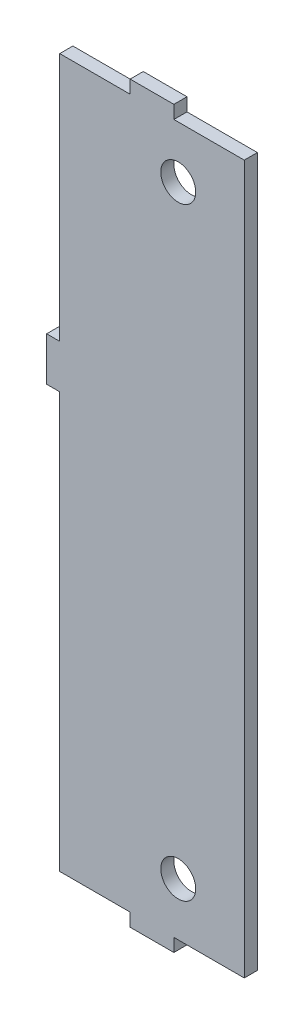
ISO-10303-21;
HEADER;
FILE_DESCRIPTION(('STEP AP214'),'2;1');
FILE_NAME('part.step','',(''),(''),'','','');
FILE_SCHEMA(('AUTOMOTIVE_DESIGN { 1 0 10303 214 1 1 1 1 }'));
ENDSEC;
DATA;
#1=APPLICATION_CONTEXT('core data for automotive mechanical design processes');
#2=APPLICATION_PROTOCOL_DEFINITION('international standard','automotive_design',2000,#1);
#3=PRODUCT_CONTEXT('',#1,'mechanical');
#4=PRODUCT('Part','Part','',(#3));
#5=PRODUCT_RELATED_PRODUCT_CATEGORY('part','',(#4));
#6=PRODUCT_DEFINITION_FORMATION('','',#4);
#7=PRODUCT_DEFINITION_CONTEXT('part definition',#1,'design');
#8=PRODUCT_DEFINITION('design','',#6,#7);
#9=PRODUCT_DEFINITION_SHAPE('','',#8);
#10=(LENGTH_UNIT() NAMED_UNIT(*) SI_UNIT(.MILLI.,.METRE.));
#11=(NAMED_UNIT(*) PLANE_ANGLE_UNIT() SI_UNIT($,.RADIAN.));
#12=(NAMED_UNIT(*) SI_UNIT($,.STERADIAN.) SOLID_ANGLE_UNIT());
#13=UNCERTAINTY_MEASURE_WITH_UNIT(LENGTH_MEASURE(1.E-05),#10,'distance_accuracy_value','');
#14=(GEOMETRIC_REPRESENTATION_CONTEXT(3) GLOBAL_UNCERTAINTY_ASSIGNED_CONTEXT((#13)) GLOBAL_UNIT_ASSIGNED_CONTEXT((#10,
#11,#12)) REPRESENTATION_CONTEXT('',''));
#15=CARTESIAN_POINT('',(0.,0.,0.));
#16=DIRECTION('',(0.,0.,1.));
#17=DIRECTION('',(1.,0.,0.));
#18=AXIS2_PLACEMENT_3D('',#15,#16,#17);
#19=CARTESIAN_POINT('',(-21.1,-60.,1.5));
#20=DIRECTION('',(0.,-1.,0.));
#21=DIRECTION('',(0.,0.,-1.));
#22=AXIS2_PLACEMENT_3D('',#19,#20,#21);
#23=PLANE('',#22);
#24=DIRECTION('',(-1.,0.,0.));
#25=VECTOR('',#24,1.);
#26=CARTESIAN_POINT('',(-21.1,-60.,-1.5));
#27=LINE('',#26,#25);
#28=CARTESIAN_POINT('',(-21.1,-60.,-1.5));
#29=VERTEX_POINT('',#28);
#30=CARTESIAN_POINT('',(-24.1,-60.,-1.5));
#31=VERTEX_POINT('',#30);
#32=EDGE_CURVE('E179',#29,#31,#27,.T.);
#33=ORIENTED_EDGE('',*,*,#32,.T.);
#34=DIRECTION('',(0.,0.,-1.));
#35=VECTOR('',#34,1.);
#36=CARTESIAN_POINT('',(-24.1,-60.,1.5));
#37=LINE('',#36,#35);
#38=CARTESIAN_POINT('',(-24.1,-60.,1.5));
#39=VERTEX_POINT('',#38);
#40=EDGE_CURVE('E11',#39,#31,#37,.T.);
#41=ORIENTED_EDGE('',*,*,#40,.F.);
#42=DIRECTION('',(-1.,0.,0.));
#43=VECTOR('',#42,1.);
#44=CARTESIAN_POINT('',(-21.1,-60.,1.5));
#45=LINE('',#44,#43);
#46=CARTESIAN_POINT('',(-21.1,-60.,1.5));
#47=VERTEX_POINT('',#46);
#48=EDGE_CURVE('E210',#47,#39,#45,.T.);
#49=ORIENTED_EDGE('',*,*,#48,.F.);
#50=DIRECTION('',(0.,0.,-1.));
#51=VECTOR('',#50,1.);
#52=CARTESIAN_POINT('',(-21.1,-60.,1.5));
#53=LINE('',#52,#51);
#54=EDGE_CURVE('E175',#47,#29,#53,.T.);
#55=ORIENTED_EDGE('',*,*,#54,.T.);
#56=EDGE_LOOP('',(#33,#41,#49,#55));
#57=FACE_BOUND('',#56,.T.);
#58=ADVANCED_FACE('F35',(#57),#23,.F.);
#59=CARTESIAN_POINT('',(-24.1,-60.,1.5));
#60=DIRECTION('',(1.,0.,0.));
#61=DIRECTION('',(0.,0.,-1.));
#62=AXIS2_PLACEMENT_3D('',#59,#60,#61);
#63=PLANE('',#62);
#64=DIRECTION('',(0.,-1.,0.));
#65=VECTOR('',#64,1.);
#66=CARTESIAN_POINT('',(-24.1,-60.,-1.5));
#67=LINE('',#66,#65);
#68=CARTESIAN_POINT('',(-24.1,-70.,-1.5));
#69=VERTEX_POINT('',#68);
#70=EDGE_CURVE('E182',#31,#69,#67,.T.);
#71=ORIENTED_EDGE('',*,*,#70,.T.);
#72=DIRECTION('',(0.,0.,-1.));
#73=VECTOR('',#72,1.);
#74=CARTESIAN_POINT('',(-24.1,-70.,1.5));
#75=LINE('',#74,#73);
#76=CARTESIAN_POINT('',(-24.1,-70.,1.5));
#77=VERTEX_POINT('',#76);
#78=EDGE_CURVE('E43',#77,#69,#75,.T.);
#79=ORIENTED_EDGE('',*,*,#78,.F.);
#80=DIRECTION('',(0.,-1.,0.));
#81=VECTOR('',#80,1.);
#82=CARTESIAN_POINT('',(-24.1,-60.,1.5));
#83=LINE('',#82,#81);
#84=EDGE_CURVE('E118',#39,#77,#83,.T.);
#85=ORIENTED_EDGE('',*,*,#84,.F.);
#86=ORIENTED_EDGE('',*,*,#40,.T.);
#87=EDGE_LOOP('',(#71,#79,#85,#86));
#88=FACE_BOUND('',#87,.T.);
#89=ADVANCED_FACE('F310',(#88),#63,.F.);
#90=CARTESIAN_POINT('',(-24.1,-70.,1.5));
#91=DIRECTION('',(0.,1.,0.));
#92=DIRECTION('',(0.,0.,1.));
#93=AXIS2_PLACEMENT_3D('',#90,#91,#92);
#94=PLANE('',#93);
#95=DIRECTION('',(1.,0.,0.));
#96=VECTOR('',#95,1.);
#97=CARTESIAN_POINT('',(-24.1,-70.,-1.5));
#98=LINE('',#97,#96);
#99=CARTESIAN_POINT('',(-21.1,-70.,-1.5));
#100=VERTEX_POINT('',#99);
#101=EDGE_CURVE('E185',#69,#100,#98,.T.);
#102=ORIENTED_EDGE('',*,*,#101,.T.);
#103=DIRECTION('',(0.,0.,-1.));
#104=VECTOR('',#103,1.);
#105=CARTESIAN_POINT('',(-21.1,-70.,1.5));
#106=LINE('',#105,#104);
#107=CARTESIAN_POINT('',(-21.1,-70.,1.5));
#108=VERTEX_POINT('',#107);
#109=EDGE_CURVE('E241',#108,#100,#106,.T.);
#110=ORIENTED_EDGE('',*,*,#109,.F.);
#111=DIRECTION('',(1.,0.,0.));
#112=VECTOR('',#111,1.);
#113=CARTESIAN_POINT('',(-24.1,-70.,1.5));
#114=LINE('',#113,#112);
#115=EDGE_CURVE('E249',#77,#108,#114,.T.);
#116=ORIENTED_EDGE('',*,*,#115,.F.);
#117=ORIENTED_EDGE('',*,*,#78,.T.);
#118=EDGE_LOOP('',(#102,#110,#116,#117));
#119=FACE_BOUND('',#118,.T.);
#120=ADVANCED_FACE('F247',(#119),#94,.F.);
#121=CARTESIAN_POINT('',(-21.1,-70.,1.5));
#122=DIRECTION('',(1.,0.,0.));
#123=DIRECTION('',(0.,1.,0.));
#124=AXIS2_PLACEMENT_3D('',#121,#122,#123);
#125=PLANE('',#124);
#126=DIRECTION('',(0.,-1.,0.));
#127=VECTOR('',#126,1.);
#128=CARTESIAN_POINT('',(-21.1,-70.,-1.5));
#129=LINE('',#128,#127);
#130=CARTESIAN_POINT('',(-21.1,-165.,-1.5));
#131=VERTEX_POINT('',#130);
#132=EDGE_CURVE('E187',#100,#131,#129,.T.);
#133=ORIENTED_EDGE('',*,*,#132,.T.);
#134=DIRECTION('',(0.,0.,-1.));
#135=VECTOR('',#134,1.);
#136=CARTESIAN_POINT('',(-21.1,-165.,1.5));
#137=LINE('',#136,#135);
#138=CARTESIAN_POINT('',(-21.1,-165.,1.5));
#139=VERTEX_POINT('',#138);
#140=EDGE_CURVE('E238',#139,#131,#137,.T.);
#141=ORIENTED_EDGE('',*,*,#140,.F.);
#142=DIRECTION('',(0.,-1.,0.));
#143=VECTOR('',#142,1.);
#144=CARTESIAN_POINT('',(-21.1,-70.,1.5));
#145=LINE('',#144,#143);
#146=EDGE_CURVE('E267',#108,#139,#145,.T.);
#147=ORIENTED_EDGE('',*,*,#146,.F.);
#148=ORIENTED_EDGE('',*,*,#109,.T.);
#149=EDGE_LOOP('',(#133,#141,#147,#148));
#150=FACE_BOUND('',#149,.T.);
#151=ADVANCED_FACE('F258',(#150),#125,.F.);
#152=CARTESIAN_POINT('',(-21.1,-165.,1.5));
#153=DIRECTION('',(0.,1.,0.));
#154=DIRECTION('',(0.,0.,1.));
#155=AXIS2_PLACEMENT_3D('',#152,#153,#154);
#156=PLANE('',#155);
#157=DIRECTION('',(1.,0.,0.));
#158=VECTOR('',#157,1.);
#159=CARTESIAN_POINT('',(-21.1,-165.,-1.5));
#160=LINE('',#159,#158);
#161=CARTESIAN_POINT('',(-4.99999999999998,-165.,-1.5));
#162=VERTEX_POINT('',#161);
#163=EDGE_CURVE('E189',#131,#162,#160,.T.);
#164=ORIENTED_EDGE('',*,*,#163,.T.);
#165=DIRECTION('',(0.,0.,-1.));
#166=VECTOR('',#165,1.);
#167=CARTESIAN_POINT('',(-4.99999999999998,-165.,1.5));
#168=LINE('',#167,#166);
#169=CARTESIAN_POINT('',(-4.99999999999998,-165.,1.5));
#170=VERTEX_POINT('',#169);
#171=EDGE_CURVE('E235',#170,#162,#168,.T.);
#172=ORIENTED_EDGE('',*,*,#171,.F.);
#173=DIRECTION('',(1.,0.,0.));
#174=VECTOR('',#173,1.);
#175=CARTESIAN_POINT('',(-21.1,-165.,1.5));
#176=LINE('',#175,#174);
#177=EDGE_CURVE('E264',#139,#170,#176,.T.);
#178=ORIENTED_EDGE('',*,*,#177,.F.);
#179=ORIENTED_EDGE('',*,*,#140,.T.);
#180=EDGE_LOOP('',(#164,#172,#178,#179));
#181=FACE_BOUND('',#180,.T.);
#182=ADVANCED_FACE('F262',(#181),#156,.F.);
#183=CARTESIAN_POINT('',(-4.99999999999998,-165.,1.5));
#184=DIRECTION('',(1.,0.,0.));
#185=DIRECTION('',(0.,1.,0.));
#186=AXIS2_PLACEMENT_3D('',#183,#184,#185);
#187=PLANE('',#186);
#188=DIRECTION('',(0.,-1.,0.));
#189=VECTOR('',#188,1.);
#190=CARTESIAN_POINT('',(-4.99999999999998,-165.,-1.5));
#191=LINE('',#190,#189);
#192=CARTESIAN_POINT('',(-4.99999999999998,-168.,-1.5));
#193=VERTEX_POINT('',#192);
#194=EDGE_CURVE('E191',#162,#193,#191,.T.);
#195=ORIENTED_EDGE('',*,*,#194,.T.);
#196=DIRECTION('',(0.,0.,-1.));
#197=VECTOR('',#196,1.);
#198=CARTESIAN_POINT('',(-4.99999999999998,-168.,1.5));
#199=LINE('',#198,#197);
#200=CARTESIAN_POINT('',(-4.99999999999998,-168.,1.5));
#201=VERTEX_POINT('',#200);
#202=EDGE_CURVE('E232',#201,#193,#199,.T.);
#203=ORIENTED_EDGE('',*,*,#202,.F.);
#204=DIRECTION('',(0.,-1.,0.));
#205=VECTOR('',#204,1.);
#206=CARTESIAN_POINT('',(-4.99999999999998,-165.,1.5));
#207=LINE('',#206,#205);
#208=EDGE_CURVE('E266',#170,#201,#207,.T.);
#209=ORIENTED_EDGE('',*,*,#208,.F.);
#210=ORIENTED_EDGE('',*,*,#171,.T.);
#211=EDGE_LOOP('',(#195,#203,#209,#210));
#212=FACE_BOUND('',#211,.T.);
#213=ADVANCED_FACE('F323',(#212),#187,.F.);
#214=CARTESIAN_POINT('',(-4.99999999999998,-168.,1.5));
#215=DIRECTION('',(0.,1.,0.));
#216=DIRECTION('',(0.,0.,1.));
#217=AXIS2_PLACEMENT_3D('',#214,#215,#216);
#218=PLANE('',#217);
#219=DIRECTION('',(1.,0.,0.));
#220=VECTOR('',#219,1.);
#221=CARTESIAN_POINT('',(-4.99999999999998,-168.,-1.5));
#222=LINE('',#221,#220);
#223=CARTESIAN_POINT('',(5.00000000000002,-168.,-1.5));
#224=VERTEX_POINT('',#223);
#225=EDGE_CURVE('E193',#193,#224,#222,.T.);
#226=ORIENTED_EDGE('',*,*,#225,.T.);
#227=DIRECTION('',(0.,0.,-1.));
#228=VECTOR('',#227,1.);
#229=CARTESIAN_POINT('',(5.00000000000002,-168.,1.5));
#230=LINE('',#229,#228);
#231=CARTESIAN_POINT('',(5.00000000000002,-168.,1.5));
#232=VERTEX_POINT('',#231);
#233=EDGE_CURVE('E229',#232,#224,#230,.T.);
#234=ORIENTED_EDGE('',*,*,#233,.F.);
#235=DIRECTION('',(1.,0.,0.));
#236=VECTOR('',#235,1.);
#237=CARTESIAN_POINT('',(-4.99999999999998,-168.,1.5));
#238=LINE('',#237,#236);
#239=EDGE_CURVE('E269',#201,#232,#238,.T.);
#240=ORIENTED_EDGE('',*,*,#239,.F.);
#241=ORIENTED_EDGE('',*,*,#202,.T.);
#242=EDGE_LOOP('',(#226,#234,#240,#241));
#243=FACE_BOUND('',#242,.T.);
#244=ADVANCED_FACE('F326',(#243),#218,.F.);
#245=CARTESIAN_POINT('',(5.00000000000002,-168.,1.5));
#246=DIRECTION('',(-1.,0.,0.));
#247=DIRECTION('',(0.,0.,1.));
#248=AXIS2_PLACEMENT_3D('',#245,#246,#247);
#249=PLANE('',#248);
#250=DIRECTION('',(0.,1.,0.));
#251=VECTOR('',#250,1.);
#252=CARTESIAN_POINT('',(5.00000000000002,-168.,-1.5));
#253=LINE('',#252,#251);
#254=CARTESIAN_POINT('',(5.00000000000002,-165.,-1.5));
#255=VERTEX_POINT('',#254);
#256=EDGE_CURVE('E195',#224,#255,#253,.T.);
#257=ORIENTED_EDGE('',*,*,#256,.T.);
#258=DIRECTION('',(0.,0.,-1.));
#259=VECTOR('',#258,1.);
#260=CARTESIAN_POINT('',(5.00000000000002,-165.,1.5));
#261=LINE('',#260,#259);
#262=CARTESIAN_POINT('',(5.00000000000002,-165.,1.5));
#263=VERTEX_POINT('',#262);
#264=EDGE_CURVE('E226',#263,#255,#261,.T.);
#265=ORIENTED_EDGE('',*,*,#264,.F.);
#266=DIRECTION('',(0.,1.,0.));
#267=VECTOR('',#266,1.);
#268=CARTESIAN_POINT('',(5.00000000000002,-168.,1.5));
#269=LINE('',#268,#267);
#270=EDGE_CURVE('E275',#232,#263,#269,.T.);
#271=ORIENTED_EDGE('',*,*,#270,.F.);
#272=ORIENTED_EDGE('',*,*,#233,.T.);
#273=EDGE_LOOP('',(#257,#265,#271,#272));
#274=FACE_BOUND('',#273,.T.);
#275=ADVANCED_FACE('F330',(#274),#249,.F.);
#276=CARTESIAN_POINT('',(5.00000000000002,-165.,1.5));
#277=DIRECTION('',(0.,1.,0.));
#278=DIRECTION('',(0.,0.,1.));
#279=AXIS2_PLACEMENT_3D('',#276,#277,#278);
#280=PLANE('',#279);
#281=DIRECTION('',(1.,0.,0.));
#282=VECTOR('',#281,1.);
#283=CARTESIAN_POINT('',(5.00000000000002,-165.,-1.5));
#284=LINE('',#283,#282);
#285=CARTESIAN_POINT('',(21.1,-165.,-1.5));
#286=VERTEX_POINT('',#285);
#287=EDGE_CURVE('E197',#255,#286,#284,.T.);
#288=ORIENTED_EDGE('',*,*,#287,.T.);
#289=DIRECTION('',(0.,0.,-1.));
#290=VECTOR('',#289,1.);
#291=CARTESIAN_POINT('',(21.1,-165.,1.5));
#292=LINE('',#291,#290);
#293=CARTESIAN_POINT('',(21.1,-165.,1.5));
#294=VERTEX_POINT('',#293);
#295=EDGE_CURVE('E223',#294,#286,#292,.T.);
#296=ORIENTED_EDGE('',*,*,#295,.F.);
#297=DIRECTION('',(1.,0.,0.));
#298=VECTOR('',#297,1.);
#299=CARTESIAN_POINT('',(5.00000000000002,-165.,1.5));
#300=LINE('',#299,#298);
#301=EDGE_CURVE('E277',#263,#294,#300,.T.);
#302=ORIENTED_EDGE('',*,*,#301,.F.);
#303=ORIENTED_EDGE('',*,*,#264,.T.);
#304=EDGE_LOOP('',(#288,#296,#302,#303));
#305=FACE_BOUND('',#304,.T.);
#306=ADVANCED_FACE('F334',(#305),#280,.F.);
#307=CARTESIAN_POINT('',(21.1,-3.,1.5));
#308=DIRECTION('',(-1.,0.,0.));
#309=DIRECTION('',(0.,0.,1.));
#310=AXIS2_PLACEMENT_3D('',#307,#308,#309);
#311=PLANE('',#310);
#312=DIRECTION('',(0.,1.,0.));
#313=VECTOR('',#312,1.);
#314=CARTESIAN_POINT('',(21.1,-3.,-1.5));
#315=LINE('',#314,#313);
#316=CARTESIAN_POINT('',(21.1,-3.,-1.5));
#317=VERTEX_POINT('',#316);
#318=EDGE_CURVE('E199',#286,#317,#315,.T.);
#319=ORIENTED_EDGE('',*,*,#318,.T.);
#320=DIRECTION('',(0.,0.,-1.));
#321=VECTOR('',#320,1.);
#322=CARTESIAN_POINT('',(21.1,-3.,1.5));
#323=LINE('',#322,#321);
#324=CARTESIAN_POINT('',(21.1,-3.,1.5));
#325=VERTEX_POINT('',#324);
#326=EDGE_CURVE('E220',#325,#317,#323,.T.);
#327=ORIENTED_EDGE('',*,*,#326,.F.);
#328=DIRECTION('',(0.,1.,0.));
#329=VECTOR('',#328,1.);
#330=CARTESIAN_POINT('',(21.1,-3.,1.5));
#331=LINE('',#330,#329);
#332=EDGE_CURVE('E279',#294,#325,#331,.T.);
#333=ORIENTED_EDGE('',*,*,#332,.F.);
#334=ORIENTED_EDGE('',*,*,#295,.T.);
#335=EDGE_LOOP('',(#319,#327,#333,#334));
#336=FACE_BOUND('',#335,.T.);
#337=ADVANCED_FACE('F338',(#336),#311,.F.);
#338=CARTESIAN_POINT('',(5.,-3.,1.5));
#339=DIRECTION('',(0.,-1.,0.));
#340=DIRECTION('',(0.,0.,-1.));
#341=AXIS2_PLACEMENT_3D('',#338,#339,#340);
#342=PLANE('',#341);
#343=DIRECTION('',(-1.,0.,0.));
#344=VECTOR('',#343,1.);
#345=CARTESIAN_POINT('',(5.,-3.,-1.5));
#346=LINE('',#345,#344);
#347=CARTESIAN_POINT('',(5.,-3.,-1.5));
#348=VERTEX_POINT('',#347);
#349=EDGE_CURVE('E201',#317,#348,#346,.T.);
#350=ORIENTED_EDGE('',*,*,#349,.T.);
#351=DIRECTION('',(0.,0.,-1.));
#352=VECTOR('',#351,1.);
#353=CARTESIAN_POINT('',(5.,-3.,1.5));
#354=LINE('',#353,#352);
#355=CARTESIAN_POINT('',(5.,-3.,1.5));
#356=VERTEX_POINT('',#355);
#357=EDGE_CURVE('E217',#356,#348,#354,.T.);
#358=ORIENTED_EDGE('',*,*,#357,.F.);
#359=DIRECTION('',(-1.,0.,0.));
#360=VECTOR('',#359,1.);
#361=CARTESIAN_POINT('',(5.,-3.,1.5));
#362=LINE('',#361,#360);
#363=EDGE_CURVE('E281',#325,#356,#362,.T.);
#364=ORIENTED_EDGE('',*,*,#363,.F.);
#365=ORIENTED_EDGE('',*,*,#326,.T.);
#366=EDGE_LOOP('',(#350,#358,#364,#365));
#367=FACE_BOUND('',#366,.T.);
#368=ADVANCED_FACE('F342',(#367),#342,.F.);
#369=CARTESIAN_POINT('',(5.,0.,1.5));
#370=DIRECTION('',(-1.,0.,0.));
#371=DIRECTION('',(0.,0.,1.));
#372=AXIS2_PLACEMENT_3D('',#369,#370,#371);
#373=PLANE('',#372);
#374=DIRECTION('',(0.,1.,0.));
#375=VECTOR('',#374,1.);
#376=CARTESIAN_POINT('',(5.,0.,-1.5));
#377=LINE('',#376,#375);
#378=CARTESIAN_POINT('',(5.,0.,-1.5));
#379=VERTEX_POINT('',#378);
#380=EDGE_CURVE('E203',#348,#379,#377,.T.);
#381=ORIENTED_EDGE('',*,*,#380,.T.);
#382=DIRECTION('',(0.,0.,-1.));
#383=VECTOR('',#382,1.);
#384=CARTESIAN_POINT('',(5.,0.,1.5));
#385=LINE('',#384,#383);
#386=CARTESIAN_POINT('',(5.,0.,1.5));
#387=VERTEX_POINT('',#386);
#388=EDGE_CURVE('E214',#387,#379,#385,.T.);
#389=ORIENTED_EDGE('',*,*,#388,.F.);
#390=DIRECTION('',(0.,1.,0.));
#391=VECTOR('',#390,1.);
#392=CARTESIAN_POINT('',(5.,0.,1.5));
#393=LINE('',#392,#391);
#394=EDGE_CURVE('E283',#356,#387,#393,.T.);
#395=ORIENTED_EDGE('',*,*,#394,.F.);
#396=ORIENTED_EDGE('',*,*,#357,.T.);
#397=EDGE_LOOP('',(#381,#389,#395,#396));
#398=FACE_BOUND('',#397,.T.);
#399=ADVANCED_FACE('F289',(#398),#373,.F.);
#400=CARTESIAN_POINT('',(-5.,0.,1.5));
#401=DIRECTION('',(0.,-1.,0.));
#402=DIRECTION('',(1.,0.,0.));
#403=AXIS2_PLACEMENT_3D('',#400,#401,#402);
#404=PLANE('',#403);
#405=DIRECTION('',(-1.,0.,0.));
#406=VECTOR('',#405,1.);
#407=CARTESIAN_POINT('',(-5.,0.,-1.5));
#408=LINE('',#407,#406);
#409=CARTESIAN_POINT('',(-5.,0.,-1.5));
#410=VERTEX_POINT('',#409);
#411=EDGE_CURVE('E205',#379,#410,#408,.T.);
#412=ORIENTED_EDGE('',*,*,#411,.T.);
#413=DIRECTION('',(0.,0.,-1.));
#414=VECTOR('',#413,1.);
#415=CARTESIAN_POINT('',(-5.,0.,1.5));
#416=LINE('',#415,#414);
#417=CARTESIAN_POINT('',(-5.,0.,1.5));
#418=VERTEX_POINT('',#417);
#419=EDGE_CURVE('E170',#418,#410,#416,.T.);
#420=ORIENTED_EDGE('',*,*,#419,.F.);
#421=DIRECTION('',(-1.,0.,0.));
#422=VECTOR('',#421,1.);
#423=CARTESIAN_POINT('',(-5.,0.,1.5));
#424=LINE('',#423,#422);
#425=EDGE_CURVE('E161',#387,#418,#424,.T.);
#426=ORIENTED_EDGE('',*,*,#425,.F.);
#427=ORIENTED_EDGE('',*,*,#388,.T.);
#428=EDGE_LOOP('',(#412,#420,#426,#427));
#429=FACE_BOUND('',#428,.T.);
#430=ADVANCED_FACE('F293',(#429),#404,.F.);
#431=CARTESIAN_POINT('',(-5.,0.,1.5));
#432=DIRECTION('',(1.,0.,0.));
#433=DIRECTION('',(0.,0.,-1.));
#434=AXIS2_PLACEMENT_3D('',#431,#432,#433);
#435=PLANE('',#434);
#436=DIRECTION('',(0.,-1.,0.));
#437=VECTOR('',#436,1.);
#438=CARTESIAN_POINT('',(-5.,0.,-1.5));
#439=LINE('',#438,#437);
#440=CARTESIAN_POINT('',(-5.,-3.,-1.5));
#441=VERTEX_POINT('',#440);
#442=EDGE_CURVE('E169',#410,#441,#439,.T.);
#443=ORIENTED_EDGE('',*,*,#442,.T.);
#444=DIRECTION('',(0.,0.,-1.));
#445=VECTOR('',#444,1.);
#446=CARTESIAN_POINT('',(-5.,-3.,1.5));
#447=LINE('',#446,#445);
#448=CARTESIAN_POINT('',(-5.,-3.,1.5));
#449=VERTEX_POINT('',#448);
#450=EDGE_CURVE('E166',#449,#441,#447,.T.);
#451=ORIENTED_EDGE('',*,*,#450,.F.);
#452=DIRECTION('',(0.,-1.,0.));
#453=VECTOR('',#452,1.);
#454=CARTESIAN_POINT('',(-5.,0.,1.5));
#455=LINE('',#454,#453);
#456=EDGE_CURVE('E155',#418,#449,#455,.T.);
#457=ORIENTED_EDGE('',*,*,#456,.F.);
#458=ORIENTED_EDGE('',*,*,#419,.T.);
#459=EDGE_LOOP('',(#443,#451,#457,#458));
#460=FACE_BOUND('',#459,.T.);
#461=ADVANCED_FACE('F167',(#460),#435,.F.);
#462=CARTESIAN_POINT('',(-5.,-3.,1.5));
#463=DIRECTION('',(0.,-1.,0.));
#464=DIRECTION('',(1.,0.,0.));
#465=AXIS2_PLACEMENT_3D('',#462,#463,#464);
#466=PLANE('',#465);
#467=DIRECTION('',(-1.,0.,0.));
#468=VECTOR('',#467,1.);
#469=CARTESIAN_POINT('',(-5.,-3.,-1.5));
#470=LINE('',#469,#468);
#471=CARTESIAN_POINT('',(-21.1,-3.,-1.5));
#472=VERTEX_POINT('',#471);
#473=EDGE_CURVE('E104',#441,#472,#470,.T.);
#474=ORIENTED_EDGE('',*,*,#473,.T.);
#475=DIRECTION('',(0.,0.,-1.));
#476=VECTOR('',#475,1.);
#477=CARTESIAN_POINT('',(-21.1,-3.,1.5));
#478=LINE('',#477,#476);
#479=CARTESIAN_POINT('',(-21.1,-3.,1.5));
#480=VERTEX_POINT('',#479);
#481=EDGE_CURVE('E171',#480,#472,#478,.T.);
#482=ORIENTED_EDGE('',*,*,#481,.F.);
#483=DIRECTION('',(-1.,0.,0.));
#484=VECTOR('',#483,1.);
#485=CARTESIAN_POINT('',(-5.,-3.,1.5));
#486=LINE('',#485,#484);
#487=EDGE_CURVE('E159',#449,#480,#486,.T.);
#488=ORIENTED_EDGE('',*,*,#487,.F.);
#489=ORIENTED_EDGE('',*,*,#450,.T.);
#490=EDGE_LOOP('',(#474,#482,#488,#489));
#491=FACE_BOUND('',#490,.T.);
#492=ADVANCED_FACE('F173',(#491),#466,.F.);
#493=CARTESIAN_POINT('',(-21.1,-3.,1.5));
#494=DIRECTION('',(1.,0.,0.));
#495=DIRECTION('',(0.,1.,0.));
#496=AXIS2_PLACEMENT_3D('',#493,#494,#495);
#497=PLANE('',#496);
#498=DIRECTION('',(0.,-1.,0.));
#499=VECTOR('',#498,1.);
#500=CARTESIAN_POINT('',(-21.1,-3.,-1.5));
#501=LINE('',#500,#499);
#502=EDGE_CURVE('E110',#472,#29,#501,.T.);
#503=ORIENTED_EDGE('',*,*,#502,.T.);
#504=ORIENTED_EDGE('',*,*,#54,.F.);
#505=DIRECTION('',(0.,-1.,0.));
#506=VECTOR('',#505,1.);
#507=CARTESIAN_POINT('',(-21.1,-3.,1.5));
#508=LINE('',#507,#506);
#509=EDGE_CURVE('E51',#480,#47,#508,.T.);
#510=ORIENTED_EDGE('',*,*,#509,.F.);
#511=ORIENTED_EDGE('',*,*,#481,.T.);
#512=EDGE_LOOP('',(#503,#504,#510,#511));
#513=FACE_BOUND('',#512,.T.);
#514=ADVANCED_FACE('F297',(#513),#497,.F.);
#515=CARTESIAN_POINT('',(0.,0.,1.5));
#516=DIRECTION('',(0.,0.,1.));
#517=DIRECTION('',(1.,0.,0.));
#518=AXIS2_PLACEMENT_3D('',#515,#516,#517);
#519=PLANE('',#518);
#520=CARTESIAN_POINT('',(6.0000000000006,-14.9000000000008,1.5));
#521=DIRECTION('',(0.,0.,1.));
#522=DIRECTION('',(1.,0.,0.));
#523=AXIS2_PLACEMENT_3D('',#520,#521,#522);
#524=CIRCLE('',#523,4.);
#525=CARTESIAN_POINT('',(10.0000000000006,-14.9000000000008,1.5));
#526=VERTEX_POINT('',#525);
#527=EDGE_CURVE('E407',#526,#526,#524,.T.);
#528=ORIENTED_EDGE('',*,*,#527,.F.);
#529=EDGE_LOOP('',(#528));
#530=FACE_BOUND('',#529,.T.);
#531=CARTESIAN_POINT('',(6.00000000000063,-152.900000000001,1.5));
#532=DIRECTION('',(0.,0.,1.));
#533=DIRECTION('',(1.,0.,0.));
#534=AXIS2_PLACEMENT_3D('',#531,#532,#533);
#535=CIRCLE('',#534,4.);
#536=CARTESIAN_POINT('',(10.0000000000006,-152.900000000001,1.5));
#537=VERTEX_POINT('',#536);
#538=EDGE_CURVE('E409',#537,#537,#535,.T.);
#539=ORIENTED_EDGE('',*,*,#538,.F.);
#540=EDGE_LOOP('',(#539));
#541=FACE_BOUND('',#540,.T.);
#542=ORIENTED_EDGE('',*,*,#48,.T.);
#543=ORIENTED_EDGE('',*,*,#84,.T.);
#544=ORIENTED_EDGE('',*,*,#115,.T.);
#545=ORIENTED_EDGE('',*,*,#146,.T.);
#546=ORIENTED_EDGE('',*,*,#177,.T.);
#547=ORIENTED_EDGE('',*,*,#208,.T.);
#548=ORIENTED_EDGE('',*,*,#239,.T.);
#549=ORIENTED_EDGE('',*,*,#270,.T.);
#550=ORIENTED_EDGE('',*,*,#301,.T.);
#551=ORIENTED_EDGE('',*,*,#332,.T.);
#552=ORIENTED_EDGE('',*,*,#363,.T.);
#553=ORIENTED_EDGE('',*,*,#394,.T.);
#554=ORIENTED_EDGE('',*,*,#425,.T.);
#555=ORIENTED_EDGE('',*,*,#456,.T.);
#556=ORIENTED_EDGE('',*,*,#487,.T.);
#557=ORIENTED_EDGE('',*,*,#509,.T.);
#558=EDGE_LOOP('',(#542,#543,#544,#545,#546,#547,#548,#549,#550,#551,#552,#553,#554,#555,#556,#557));
#559=FACE_BOUND('',#558,.T.);
#560=ADVANCED_FACE('F157',(#530,#541,#559),#519,.T.);
#561=CARTESIAN_POINT('',(0.,0.,-1.5));
#562=DIRECTION('',(0.,0.,1.));
#563=DIRECTION('',(1.,0.,0.));
#564=AXIS2_PLACEMENT_3D('',#561,#562,#563);
#565=PLANE('',#564);
#566=CARTESIAN_POINT('',(6.0000000000006,-14.9000000000008,-1.5));
#567=DIRECTION('',(0.,0.,1.));
#568=DIRECTION('',(1.,0.,0.));
#569=AXIS2_PLACEMENT_3D('',#566,#567,#568);
#570=CIRCLE('',#569,4.);
#571=CARTESIAN_POINT('',(10.0000000000006,-14.9000000000008,-1.5));
#572=VERTEX_POINT('',#571);
#573=EDGE_CURVE('E404',#572,#572,#570,.T.);
#574=ORIENTED_EDGE('',*,*,#573,.T.);
#575=EDGE_LOOP('',(#574));
#576=FACE_BOUND('',#575,.T.);
#577=CARTESIAN_POINT('',(6.00000000000063,-152.900000000001,-1.5));
#578=DIRECTION('',(0.,0.,1.));
#579=DIRECTION('',(1.,0.,0.));
#580=AXIS2_PLACEMENT_3D('',#577,#578,#579);
#581=CIRCLE('',#580,4.);
#582=CARTESIAN_POINT('',(10.0000000000006,-152.900000000001,-1.5));
#583=VERTEX_POINT('',#582);
#584=EDGE_CURVE('E183',#583,#583,#581,.T.);
#585=ORIENTED_EDGE('',*,*,#584,.T.);
#586=EDGE_LOOP('',(#585));
#587=FACE_BOUND('',#586,.T.);
#588=ORIENTED_EDGE('',*,*,#32,.F.);
#589=ORIENTED_EDGE('',*,*,#502,.F.);
#590=ORIENTED_EDGE('',*,*,#473,.F.);
#591=ORIENTED_EDGE('',*,*,#442,.F.);
#592=ORIENTED_EDGE('',*,*,#411,.F.);
#593=ORIENTED_EDGE('',*,*,#380,.F.);
#594=ORIENTED_EDGE('',*,*,#349,.F.);
#595=ORIENTED_EDGE('',*,*,#318,.F.);
#596=ORIENTED_EDGE('',*,*,#287,.F.);
#597=ORIENTED_EDGE('',*,*,#256,.F.);
#598=ORIENTED_EDGE('',*,*,#225,.F.);
#599=ORIENTED_EDGE('',*,*,#194,.F.);
#600=ORIENTED_EDGE('',*,*,#163,.F.);
#601=ORIENTED_EDGE('',*,*,#132,.F.);
#602=ORIENTED_EDGE('',*,*,#101,.F.);
#603=ORIENTED_EDGE('',*,*,#70,.F.);
#604=EDGE_LOOP('',(#588,#589,#590,#591,#592,#593,#594,#595,#596,#597,#598,#599,#600,#601,#602,#603));
#605=FACE_BOUND('',#604,.T.);
#606=ADVANCED_FACE('F253',(#576,#587,#605),#565,.F.);
#607=CARTESIAN_POINT('',(6.00000000000063,-152.900000000001,1.5));
#608=DIRECTION('',(0.,0.,1.));
#609=DIRECTION('',(1.,0.,0.));
#610=AXIS2_PLACEMENT_3D('',#607,#608,#609);
#611=CYLINDRICAL_SURFACE('',#610,4.);
#612=ORIENTED_EDGE('',*,*,#584,.F.);
#613=EDGE_LOOP('',(#612));
#614=FACE_BOUND('',#613,.T.);
#615=ORIENTED_EDGE('',*,*,#538,.T.);
#616=EDGE_LOOP('',(#615));
#617=FACE_BOUND('',#616,.T.);
#618=ADVANCED_FACE('F375',(#614,#617),#611,.F.);
#619=CARTESIAN_POINT('',(6.0000000000006,-14.9000000000008,1.5));
#620=DIRECTION('',(0.,0.,1.));
#621=DIRECTION('',(1.,0.,0.));
#622=AXIS2_PLACEMENT_3D('',#619,#620,#621);
#623=CYLINDRICAL_SURFACE('',#622,4.);
#624=ORIENTED_EDGE('',*,*,#573,.F.);
#625=EDGE_LOOP('',(#624));
#626=FACE_BOUND('',#625,.T.);
#627=ORIENTED_EDGE('',*,*,#527,.T.);
#628=EDGE_LOOP('',(#627));
#629=FACE_BOUND('',#628,.T.);
#630=ADVANCED_FACE('F384',(#626,#629),#623,.F.);
#631=CLOSED_SHELL('',(#58,#89,#120,#151,#182,#213,#244,#275,#306,#337,#368,#399,#430,#461,#492,
#514,#560,#606,#618,#630));
#632=MANIFOLD_SOLID_BREP('B2',#631);
#633=ADVANCED_BREP_SHAPE_REPRESENTATION('',(#18,#632),#14);
#634=SHAPE_DEFINITION_REPRESENTATION(#9,#633);
ENDSEC;
END-ISO-10303-21;
